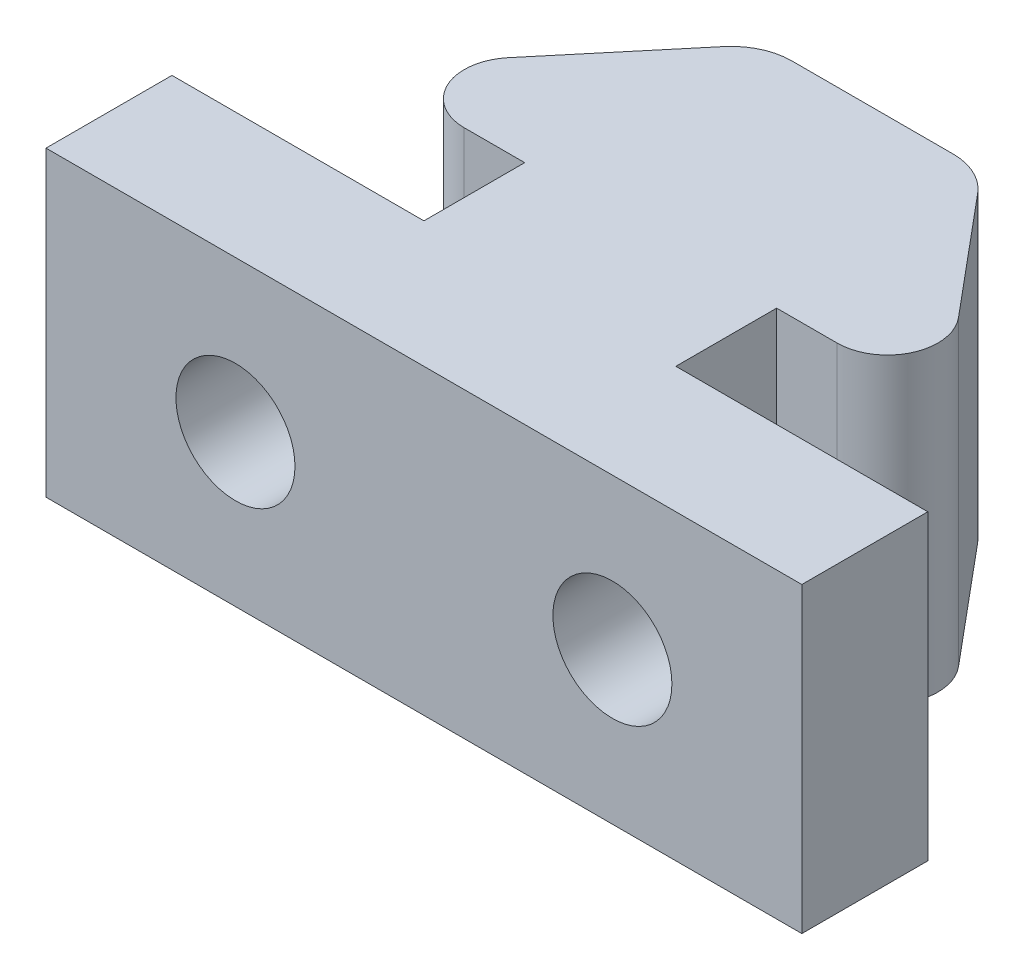
ISO-10303-21;
HEADER;
FILE_DESCRIPTION(('STEP AP214'),'2;1');
FILE_NAME('part.step','',(''),(''),'','','');
FILE_SCHEMA(('AUTOMOTIVE_DESIGN { 1 0 10303 214 1 1 1 1 }'));
ENDSEC;
DATA;
#1=APPLICATION_CONTEXT('core data for automotive mechanical design processes');
#2=APPLICATION_PROTOCOL_DEFINITION('international standard','automotive_design',2000,#1);
#3=PRODUCT_CONTEXT('',#1,'mechanical');
#4=PRODUCT('Part','Part','',(#3));
#5=PRODUCT_RELATED_PRODUCT_CATEGORY('part','',(#4));
#6=PRODUCT_DEFINITION_FORMATION('','',#4);
#7=PRODUCT_DEFINITION_CONTEXT('part definition',#1,'design');
#8=PRODUCT_DEFINITION('design','',#6,#7);
#9=PRODUCT_DEFINITION_SHAPE('','',#8);
#10=(LENGTH_UNIT() NAMED_UNIT(*) SI_UNIT(.MILLI.,.METRE.));
#11=(NAMED_UNIT(*) PLANE_ANGLE_UNIT() SI_UNIT($,.RADIAN.));
#12=(NAMED_UNIT(*) SI_UNIT($,.STERADIAN.) SOLID_ANGLE_UNIT());
#13=UNCERTAINTY_MEASURE_WITH_UNIT(LENGTH_MEASURE(1.E-05),#10,'distance_accuracy_value','');
#14=(GEOMETRIC_REPRESENTATION_CONTEXT(3) GLOBAL_UNCERTAINTY_ASSIGNED_CONTEXT((#13)) GLOBAL_UNIT_ASSIGNED_CONTEXT((#10,
#11,#12)) REPRESENTATION_CONTEXT('',''));
#15=CARTESIAN_POINT('',(0.,0.,0.));
#16=DIRECTION('',(0.,0.,1.));
#17=DIRECTION('',(1.,0.,0.));
#18=AXIS2_PLACEMENT_3D('',#15,#16,#17);
#19=CARTESIAN_POINT('',(0.,0.,0.));
#20=DIRECTION('',(0.,0.,1.));
#21=DIRECTION('',(1.,0.,0.));
#22=AXIS2_PLACEMENT_3D('',#19,#20,#21);
#23=PLANE('',#22);
#24=CARTESIAN_POINT('',(-4.75,0.,0.));
#25=DIRECTION('',(0.,0.,1.));
#26=DIRECTION('',(1.,0.,0.));
#27=AXIS2_PLACEMENT_3D('',#24,#25,#26);
#28=CIRCLE('',#27,1.5);
#29=CARTESIAN_POINT('',(-3.25,0.,0.));
#30=VERTEX_POINT('',#29);
#31=EDGE_CURVE('E180',#30,#30,#28,.F.);
#32=ORIENTED_EDGE('',*,*,#31,.F.);
#33=EDGE_LOOP('',(#32));
#34=FACE_BOUND('',#33,.T.);
#35=DIRECTION('',(0.,1.,0.));
#36=VECTOR('',#35,1.);
#37=CARTESIAN_POINT('',(-3.175,-18.2529235263508,0.));
#38=LINE('',#37,#36);
#39=CARTESIAN_POINT('',(-3.175,-3.81,0.));
#40=VERTEX_POINT('',#39);
#41=CARTESIAN_POINT('',(-3.175,3.81,0.));
#42=VERTEX_POINT('',#41);
#43=EDGE_CURVE('E64',#40,#42,#38,.T.);
#44=ORIENTED_EDGE('',*,*,#43,.F.);
#45=DIRECTION('',(1.,0.,0.));
#46=VECTOR('',#45,1.);
#47=CARTESIAN_POINT('',(-9.525,-3.81,0.));
#48=LINE('',#47,#46);
#49=CARTESIAN_POINT('',(-9.525,-3.81,0.));
#50=VERTEX_POINT('',#49);
#51=EDGE_CURVE('E251',#50,#40,#48,.T.);
#52=ORIENTED_EDGE('',*,*,#51,.F.);
#53=DIRECTION('',(0.,1.,0.));
#54=VECTOR('',#53,1.);
#55=CARTESIAN_POINT('',(-9.525,-3.81,0.));
#56=LINE('',#55,#54);
#57=CARTESIAN_POINT('',(-9.525,3.81,0.));
#58=VERTEX_POINT('',#57);
#59=EDGE_CURVE('E239',#50,#58,#56,.T.);
#60=ORIENTED_EDGE('',*,*,#59,.T.);
#61=DIRECTION('',(1.,0.,0.));
#62=VECTOR('',#61,1.);
#63=CARTESIAN_POINT('',(-9.525,3.81,0.));
#64=LINE('',#63,#62);
#65=EDGE_CURVE('E246',#58,#42,#64,.T.);
#66=ORIENTED_EDGE('',*,*,#65,.T.);
#67=EDGE_LOOP('',(#44,#52,#60,#66));
#68=FACE_BOUND('',#67,.T.);
#69=ADVANCED_FACE('F39',(#34,#68),#23,.F.);
#70=CARTESIAN_POINT('',(-9.525,3.81,3.175));
#71=DIRECTION('',(0.,1.,0.));
#72=DIRECTION('',(0.,0.,1.));
#73=AXIS2_PLACEMENT_3D('',#70,#71,#72);
#74=PLANE('',#73);
#75=ORIENTED_EDGE('',*,*,#65,.F.);
#76=DIRECTION('',(0.,0.,-1.));
#77=VECTOR('',#76,1.);
#78=CARTESIAN_POINT('',(-9.525,3.81,3.175));
#79=LINE('',#78,#77);
#80=CARTESIAN_POINT('',(-9.525,3.81,3.175));
#81=VERTEX_POINT('',#80);
#82=EDGE_CURVE('E11',#81,#58,#79,.T.);
#83=ORIENTED_EDGE('',*,*,#82,.F.);
#84=DIRECTION('',(1.,0.,0.));
#85=VECTOR('',#84,1.);
#86=CARTESIAN_POINT('',(-9.525,3.81,3.175));
#87=LINE('',#86,#85);
#88=CARTESIAN_POINT('',(9.525,3.81,3.175));
#89=VERTEX_POINT('',#88);
#90=EDGE_CURVE('E235',#81,#89,#87,.T.);
#91=ORIENTED_EDGE('',*,*,#90,.T.);
#92=DIRECTION('',(0.,0.,-1.));
#93=VECTOR('',#92,1.);
#94=CARTESIAN_POINT('',(9.525,3.81,3.175));
#95=LINE('',#94,#93);
#96=CARTESIAN_POINT('',(9.525,3.81,0.));
#97=VERTEX_POINT('',#96);
#98=EDGE_CURVE('E43',#89,#97,#95,.T.);
#99=ORIENTED_EDGE('',*,*,#98,.T.);
#100=CARTESIAN_POINT('',(3.175,3.81,0.));
#101=VERTEX_POINT('',#100);
#102=EDGE_CURVE('E179',#101,#97,#64,.T.);
#103=ORIENTED_EDGE('',*,*,#102,.F.);
#104=DIRECTION('',(0.,0.,-1.));
#105=VECTOR('',#104,1.);
#106=CARTESIAN_POINT('',(3.175,3.81,0.));
#107=LINE('',#106,#105);
#108=CARTESIAN_POINT('',(3.175,3.81,-2.54));
#109=VERTEX_POINT('',#108);
#110=EDGE_CURVE('E160',#101,#109,#107,.T.);
#111=ORIENTED_EDGE('',*,*,#110,.T.);
#112=DIRECTION('',(1.,0.,0.));
#113=VECTOR('',#112,1.);
#114=CARTESIAN_POINT('',(3.175,3.81,-2.54));
#115=LINE('',#114,#113);
#116=CARTESIAN_POINT('',(4.69937299864937,3.81,-2.54));
#117=VERTEX_POINT('',#116);
#118=EDGE_CURVE('E168',#109,#117,#115,.T.);
#119=ORIENTED_EDGE('',*,*,#118,.T.);
#120=CARTESIAN_POINT('',(4.69937299864937,3.81,-3.81));
#121=DIRECTION('',(0.,1.,0.));
#122=DIRECTION('',(0.,0.,1.));
#123=AXIS2_PLACEMENT_3D('',#120,#121,#122);
#124=CIRCLE('',#123,1.27);
#125=CARTESIAN_POINT('',(5.67365047720945,3.81,-4.6246676590921));
#126=VERTEX_POINT('',#125);
#127=EDGE_CURVE('E174',#117,#126,#124,.T.);
#128=ORIENTED_EDGE('',*,*,#127,.T.);
#129=DIRECTION('',(-0.64147059771032,0.,-0.767147620913449));
#130=VECTOR('',#129,1.);
#131=CARTESIAN_POINT('',(5.67365047720945,3.81,-4.62466765909211));
#132=LINE('',#131,#130);
#133=CARTESIAN_POINT('',(3.20113297427209,3.81,-7.58160119091053));
#134=VERTEX_POINT('',#133);
#135=EDGE_CURVE('E190',#126,#134,#132,.T.);
#136=ORIENTED_EDGE('',*,*,#135,.T.);
#137=CARTESIAN_POINT('',(2.032,3.81,-6.604));
#138=DIRECTION('',(0.,1.,0.));
#139=DIRECTION('',(0.,0.,1.));
#140=AXIS2_PLACEMENT_3D('',#137,#138,#139);
#141=CIRCLE('',#140,1.524);
#142=CARTESIAN_POINT('',(2.032,3.81,-8.128));
#143=VERTEX_POINT('',#142);
#144=EDGE_CURVE('E193',#134,#143,#141,.T.);
#145=ORIENTED_EDGE('',*,*,#144,.T.);
#146=DIRECTION('',(-1.,0.,0.));
#147=VECTOR('',#146,1.);
#148=CARTESIAN_POINT('',(2.032,3.81,-8.128));
#149=LINE('',#148,#147);
#150=CARTESIAN_POINT('',(-2.032,3.81,-8.128));
#151=VERTEX_POINT('',#150);
#152=EDGE_CURVE('E196',#143,#151,#149,.T.);
#153=ORIENTED_EDGE('',*,*,#152,.T.);
#154=CARTESIAN_POINT('',(-2.032,3.81,-6.604));
#155=DIRECTION('',(0.,1.,0.));
#156=DIRECTION('',(0.,0.,-1.));
#157=AXIS2_PLACEMENT_3D('',#154,#155,#156);
#158=CIRCLE('',#157,1.524);
#159=CARTESIAN_POINT('',(-3.2011329742721,3.81,-7.58160119091053));
#160=VERTEX_POINT('',#159);
#161=EDGE_CURVE('E199',#151,#160,#158,.T.);
#162=ORIENTED_EDGE('',*,*,#161,.T.);
#163=DIRECTION('',(-0.64147059771032,0.,0.767147620913449));
#164=VECTOR('',#163,1.);
#165=CARTESIAN_POINT('',(-5.67365047720945,3.81,-4.62466765909211));
#166=LINE('',#165,#164);
#167=CARTESIAN_POINT('',(-5.67365047720945,3.81,-4.62466765909211));
#168=VERTEX_POINT('',#167);
#169=EDGE_CURVE('E202',#160,#168,#166,.T.);
#170=ORIENTED_EDGE('',*,*,#169,.T.);
#171=CARTESIAN_POINT('',(-4.69937299864937,3.81,-3.81));
#172=DIRECTION('',(0.,1.,0.));
#173=DIRECTION('',(0.,0.,-1.));
#174=AXIS2_PLACEMENT_3D('',#171,#172,#173);
#175=CIRCLE('',#174,1.27);
#176=CARTESIAN_POINT('',(-4.69937299864937,3.81,-2.54));
#177=VERTEX_POINT('',#176);
#178=EDGE_CURVE('E205',#168,#177,#175,.T.);
#179=ORIENTED_EDGE('',*,*,#178,.T.);
#180=DIRECTION('',(1.,0.,0.));
#181=VECTOR('',#180,1.);
#182=CARTESIAN_POINT('',(-3.175,3.81,-2.54));
#183=LINE('',#182,#181);
#184=CARTESIAN_POINT('',(-3.175,3.81,-2.54));
#185=VERTEX_POINT('',#184);
#186=EDGE_CURVE('E208',#177,#185,#183,.T.);
#187=ORIENTED_EDGE('',*,*,#186,.T.);
#188=DIRECTION('',(0.,0.,1.));
#189=VECTOR('',#188,1.);
#190=CARTESIAN_POINT('',(-3.175,3.81,0.));
#191=LINE('',#190,#189);
#192=EDGE_CURVE('E211',#185,#42,#191,.T.);
#193=ORIENTED_EDGE('',*,*,#192,.T.);
#194=EDGE_LOOP('',(#75,#83,#91,#99,#103,#111,#119,#128,#136,#145,#153,#162,#170,#179,#187,#193));
#195=FACE_BOUND('',#194,.T.);
#196=ADVANCED_FACE('F41',(#195),#74,.T.);
#197=CARTESIAN_POINT('',(-9.525,-3.81,3.175));
#198=DIRECTION('',(-1.,0.,0.));
#199=DIRECTION('',(0.,0.,1.));
#200=AXIS2_PLACEMENT_3D('',#197,#198,#199);
#201=PLANE('',#200);
#202=ORIENTED_EDGE('',*,*,#59,.F.);
#203=DIRECTION('',(0.,0.,-1.));
#204=VECTOR('',#203,1.);
#205=CARTESIAN_POINT('',(-9.525,-3.81,3.175));
#206=LINE('',#205,#204);
#207=CARTESIAN_POINT('',(-9.525,-3.81,3.175));
#208=VERTEX_POINT('',#207);
#209=EDGE_CURVE('E48',#208,#50,#206,.T.);
#210=ORIENTED_EDGE('',*,*,#209,.F.);
#211=DIRECTION('',(0.,1.,0.));
#212=VECTOR('',#211,1.);
#213=CARTESIAN_POINT('',(-9.525,-3.81,3.175));
#214=LINE('',#213,#212);
#215=EDGE_CURVE('E243',#208,#81,#214,.T.);
#216=ORIENTED_EDGE('',*,*,#215,.T.);
#217=ORIENTED_EDGE('',*,*,#82,.T.);
#218=EDGE_LOOP('',(#202,#210,#216,#217));
#219=FACE_BOUND('',#218,.T.);
#220=ADVANCED_FACE('F287',(#219),#201,.T.);
#221=CARTESIAN_POINT('',(-9.525,-3.81,3.175));
#222=DIRECTION('',(0.,1.,0.));
#223=DIRECTION('',(0.,0.,1.));
#224=AXIS2_PLACEMENT_3D('',#221,#222,#223);
#225=PLANE('',#224);
#226=ORIENTED_EDGE('',*,*,#51,.T.);
#227=DIRECTION('',(0.,0.,-1.));
#228=VECTOR('',#227,1.);
#229=CARTESIAN_POINT('',(-3.175,-3.81,0.));
#230=LINE('',#229,#228);
#231=CARTESIAN_POINT('',(-3.175,-3.81,-2.54));
#232=VERTEX_POINT('',#231);
#233=EDGE_CURVE('E186',#40,#232,#230,.T.);
#234=ORIENTED_EDGE('',*,*,#233,.T.);
#235=DIRECTION('',(-1.,0.,0.));
#236=VECTOR('',#235,1.);
#237=CARTESIAN_POINT('',(-3.175,-3.81,-2.54));
#238=LINE('',#237,#236);
#239=CARTESIAN_POINT('',(-4.69937299864937,-3.81,-2.54));
#240=VERTEX_POINT('',#239);
#241=EDGE_CURVE('E319',#232,#240,#238,.T.);
#242=ORIENTED_EDGE('',*,*,#241,.T.);
#243=CARTESIAN_POINT('',(-4.69937299864937,-3.81,-3.81));
#244=DIRECTION('',(0.,1.,0.));
#245=DIRECTION('',(0.,0.,1.));
#246=AXIS2_PLACEMENT_3D('',#243,#244,#245);
#247=CIRCLE('',#246,1.27);
#248=CARTESIAN_POINT('',(-5.67365047720945,-3.81,-4.62466765909211));
#249=VERTEX_POINT('',#248);
#250=EDGE_CURVE('E318',#240,#249,#247,.F.);
#251=ORIENTED_EDGE('',*,*,#250,.T.);
#252=DIRECTION('',(0.641470597710321,0.,-0.767147620913449));
#253=VECTOR('',#252,1.);
#254=CARTESIAN_POINT('',(-5.67365047720945,-3.81,-4.62466765909211));
#255=LINE('',#254,#253);
#256=CARTESIAN_POINT('',(-3.2011329742721,-3.81,-7.58160119091053));
#257=VERTEX_POINT('',#256);
#258=EDGE_CURVE('E316',#249,#257,#255,.T.);
#259=ORIENTED_EDGE('',*,*,#258,.T.);
#260=CARTESIAN_POINT('',(-2.032,-3.81,-6.604));
#261=DIRECTION('',(0.,1.,0.));
#262=DIRECTION('',(0.,0.,1.));
#263=AXIS2_PLACEMENT_3D('',#260,#261,#262);
#264=CIRCLE('',#263,1.524);
#265=CARTESIAN_POINT('',(-2.032,-3.81,-8.128));
#266=VERTEX_POINT('',#265);
#267=EDGE_CURVE('E314',#257,#266,#264,.F.);
#268=ORIENTED_EDGE('',*,*,#267,.T.);
#269=DIRECTION('',(1.,0.,0.));
#270=VECTOR('',#269,1.);
#271=CARTESIAN_POINT('',(2.032,-3.81,-8.128));
#272=LINE('',#271,#270);
#273=CARTESIAN_POINT('',(2.032,-3.81,-8.128));
#274=VERTEX_POINT('',#273);
#275=EDGE_CURVE('E312',#266,#274,#272,.T.);
#276=ORIENTED_EDGE('',*,*,#275,.T.);
#277=CARTESIAN_POINT('',(2.032,-3.81,-6.604));
#278=DIRECTION('',(0.,1.,0.));
#279=DIRECTION('',(0.,0.,1.));
#280=AXIS2_PLACEMENT_3D('',#277,#278,#279);
#281=CIRCLE('',#280,1.524);
#282=CARTESIAN_POINT('',(3.20113297427209,-3.81,-7.58160119091053));
#283=VERTEX_POINT('',#282);
#284=EDGE_CURVE('E310',#274,#283,#281,.F.);
#285=ORIENTED_EDGE('',*,*,#284,.T.);
#286=DIRECTION('',(0.641470597710321,0.,0.767147620913449));
#287=VECTOR('',#286,1.);
#288=CARTESIAN_POINT('',(5.67365047720945,-3.81,-4.62466765909211));
#289=LINE('',#288,#287);
#290=CARTESIAN_POINT('',(5.67365047720945,-3.81,-4.6246676590921));
#291=VERTEX_POINT('',#290);
#292=EDGE_CURVE('E308',#283,#291,#289,.T.);
#293=ORIENTED_EDGE('',*,*,#292,.T.);
#294=CARTESIAN_POINT('',(4.69937299864937,-3.81,-3.81));
#295=DIRECTION('',(0.,1.,0.));
#296=DIRECTION('',(0.,0.,1.));
#297=AXIS2_PLACEMENT_3D('',#294,#295,#296);
#298=CIRCLE('',#297,1.27);
#299=CARTESIAN_POINT('',(4.69937299864937,-3.81,-2.54));
#300=VERTEX_POINT('',#299);
#301=EDGE_CURVE('E306',#291,#300,#298,.F.);
#302=ORIENTED_EDGE('',*,*,#301,.T.);
#303=DIRECTION('',(-1.,0.,0.));
#304=VECTOR('',#303,1.);
#305=CARTESIAN_POINT('',(3.175,-3.81,-2.54));
#306=LINE('',#305,#304);
#307=CARTESIAN_POINT('',(3.175,-3.81,-2.54));
#308=VERTEX_POINT('',#307);
#309=EDGE_CURVE('E215',#300,#308,#306,.T.);
#310=ORIENTED_EDGE('',*,*,#309,.T.);
#311=DIRECTION('',(0.,0.,1.));
#312=VECTOR('',#311,1.);
#313=CARTESIAN_POINT('',(3.175,-3.81,0.));
#314=LINE('',#313,#312);
#315=CARTESIAN_POINT('',(3.175,-3.81,0.));
#316=VERTEX_POINT('',#315);
#317=EDGE_CURVE('E161',#308,#316,#314,.T.);
#318=ORIENTED_EDGE('',*,*,#317,.T.);
#319=CARTESIAN_POINT('',(9.525,-3.81,0.));
#320=VERTEX_POINT('',#319);
#321=EDGE_CURVE('E56',#316,#320,#48,.T.);
#322=ORIENTED_EDGE('',*,*,#321,.T.);
#323=DIRECTION('',(0.,0.,-1.));
#324=VECTOR('',#323,1.);
#325=CARTESIAN_POINT('',(9.525,-3.81,3.175));
#326=LINE('',#325,#324);
#327=CARTESIAN_POINT('',(9.525,-3.81,3.175));
#328=VERTEX_POINT('',#327);
#329=EDGE_CURVE('E255',#328,#320,#326,.T.);
#330=ORIENTED_EDGE('',*,*,#329,.F.);
#331=DIRECTION('',(1.,0.,0.));
#332=VECTOR('',#331,1.);
#333=CARTESIAN_POINT('',(-9.525,-3.81,3.175));
#334=LINE('',#333,#332);
#335=EDGE_CURVE('E241',#208,#328,#334,.T.);
#336=ORIENTED_EDGE('',*,*,#335,.F.);
#337=ORIENTED_EDGE('',*,*,#209,.T.);
#338=EDGE_LOOP('',(#226,#234,#242,#251,#259,#268,#276,#285,#293,#302,#310,#318,#322,#330,#336,#337));
#339=FACE_BOUND('',#338,.T.);
#340=ADVANCED_FACE('F324',(#339),#225,.F.);
#341=CARTESIAN_POINT('',(9.525,-3.81,3.175));
#342=DIRECTION('',(-1.,0.,0.));
#343=DIRECTION('',(0.,0.,1.));
#344=AXIS2_PLACEMENT_3D('',#341,#342,#343);
#345=PLANE('',#344);
#346=DIRECTION('',(0.,1.,0.));
#347=VECTOR('',#346,1.);
#348=CARTESIAN_POINT('',(9.525,-3.81,0.));
#349=LINE('',#348,#347);
#350=EDGE_CURVE('E248',#320,#97,#349,.T.);
#351=ORIENTED_EDGE('',*,*,#350,.T.);
#352=ORIENTED_EDGE('',*,*,#98,.F.);
#353=DIRECTION('',(0.,1.,0.));
#354=VECTOR('',#353,1.);
#355=CARTESIAN_POINT('',(9.525,-3.81,3.175));
#356=LINE('',#355,#354);
#357=EDGE_CURVE('E238',#328,#89,#356,.T.);
#358=ORIENTED_EDGE('',*,*,#357,.F.);
#359=ORIENTED_EDGE('',*,*,#329,.T.);
#360=EDGE_LOOP('',(#351,#352,#358,#359));
#361=FACE_BOUND('',#360,.T.);
#362=ADVANCED_FACE('F262',(#361),#345,.F.);
#363=CARTESIAN_POINT('',(0.,0.,3.175));
#364=DIRECTION('',(0.,0.,1.));
#365=DIRECTION('',(1.,0.,0.));
#366=AXIS2_PLACEMENT_3D('',#363,#364,#365);
#367=PLANE('',#366);
#368=CARTESIAN_POINT('',(-4.75,0.,3.175));
#369=DIRECTION('',(0.,0.,1.));
#370=DIRECTION('',(1.,0.,0.));
#371=AXIS2_PLACEMENT_3D('',#368,#369,#370);
#372=CIRCLE('',#371,1.5);
#373=CARTESIAN_POINT('',(-3.25,0.,3.175));
#374=VERTEX_POINT('',#373);
#375=EDGE_CURVE('E183',#374,#374,#372,.T.);
#376=ORIENTED_EDGE('',*,*,#375,.F.);
#377=EDGE_LOOP('',(#376));
#378=FACE_BOUND('',#377,.T.);
#379=CARTESIAN_POINT('',(4.75,0.,3.175));
#380=DIRECTION('',(0.,0.,1.));
#381=DIRECTION('',(1.,0.,0.));
#382=AXIS2_PLACEMENT_3D('',#379,#380,#381);
#383=CIRCLE('',#382,1.5);
#384=CARTESIAN_POINT('',(6.25,0.,3.175));
#385=VERTEX_POINT('',#384);
#386=EDGE_CURVE('E297',#385,#385,#383,.T.);
#387=ORIENTED_EDGE('',*,*,#386,.F.);
#388=EDGE_LOOP('',(#387));
#389=FACE_BOUND('',#388,.T.);
#390=ORIENTED_EDGE('',*,*,#90,.F.);
#391=ORIENTED_EDGE('',*,*,#215,.F.);
#392=ORIENTED_EDGE('',*,*,#335,.T.);
#393=ORIENTED_EDGE('',*,*,#357,.T.);
#394=EDGE_LOOP('',(#390,#391,#392,#393));
#395=FACE_BOUND('',#394,.T.);
#396=ADVANCED_FACE('F266',(#378,#389,#395),#367,.T.);
#397=CARTESIAN_POINT('',(4.75,0.,0.));
#398=DIRECTION('',(0.,0.,1.));
#399=DIRECTION('',(1.,0.,0.));
#400=AXIS2_PLACEMENT_3D('',#397,#398,#399);
#401=CIRCLE('',#400,1.5);
#402=CARTESIAN_POINT('',(6.25,0.,0.));
#403=VERTEX_POINT('',#402);
#404=EDGE_CURVE('E300',#403,#403,#401,.F.);
#405=ORIENTED_EDGE('',*,*,#404,.F.);
#406=EDGE_LOOP('',(#405));
#407=FACE_BOUND('',#406,.T.);
#408=ORIENTED_EDGE('',*,*,#321,.F.);
#409=DIRECTION('',(0.,1.,0.));
#410=VECTOR('',#409,1.);
#411=CARTESIAN_POINT('',(3.175,-18.2529235263508,0.));
#412=LINE('',#411,#410);
#413=EDGE_CURVE('E165',#316,#101,#412,.T.);
#414=ORIENTED_EDGE('',*,*,#413,.T.);
#415=ORIENTED_EDGE('',*,*,#102,.T.);
#416=ORIENTED_EDGE('',*,*,#350,.F.);
#417=EDGE_LOOP('',(#408,#414,#415,#416));
#418=FACE_BOUND('',#417,.T.);
#419=ADVANCED_FACE('F263',(#407,#418),#23,.F.);
#420=CARTESIAN_POINT('',(-3.175,-18.2529235263508,0.));
#421=DIRECTION('',(-1.,0.,0.));
#422=DIRECTION('',(0.,0.,1.));
#423=AXIS2_PLACEMENT_3D('',#420,#421,#422);
#424=PLANE('',#423);
#425=ORIENTED_EDGE('',*,*,#233,.F.);
#426=ORIENTED_EDGE('',*,*,#43,.T.);
#427=ORIENTED_EDGE('',*,*,#192,.F.);
#428=DIRECTION('',(0.,1.,0.));
#429=VECTOR('',#428,1.);
#430=CARTESIAN_POINT('',(-3.175,-18.2529235263508,-2.54));
#431=LINE('',#430,#429);
#432=EDGE_CURVE('E216',#232,#185,#431,.T.);
#433=ORIENTED_EDGE('',*,*,#432,.F.);
#434=EDGE_LOOP('',(#425,#426,#427,#433));
#435=FACE_BOUND('',#434,.T.);
#436=ADVANCED_FACE('F265',(#435),#424,.T.);
#437=CARTESIAN_POINT('',(-3.175,-18.2529235263508,-2.54));
#438=DIRECTION('',(0.,0.,1.));
#439=DIRECTION('',(1.,0.,0.));
#440=AXIS2_PLACEMENT_3D('',#437,#438,#439);
#441=PLANE('',#440);
#442=ORIENTED_EDGE('',*,*,#241,.F.);
#443=ORIENTED_EDGE('',*,*,#432,.T.);
#444=ORIENTED_EDGE('',*,*,#186,.F.);
#445=DIRECTION('',(0.,1.,0.));
#446=VECTOR('',#445,1.);
#447=CARTESIAN_POINT('',(-4.69937299864937,-18.2529235263508,-2.54));
#448=LINE('',#447,#446);
#449=EDGE_CURVE('E218',#240,#177,#448,.T.);
#450=ORIENTED_EDGE('',*,*,#449,.F.);
#451=EDGE_LOOP('',(#442,#443,#444,#450));
#452=FACE_BOUND('',#451,.T.);
#453=ADVANCED_FACE('F274',(#452),#441,.T.);
#454=CARTESIAN_POINT('',(-4.69937299864937,-18.2529235263508,-3.81));
#455=DIRECTION('',(0.,1.,0.));
#456=DIRECTION('',(0.,0.,1.));
#457=AXIS2_PLACEMENT_3D('',#454,#455,#456);
#458=CYLINDRICAL_SURFACE('',#457,1.27);
#459=ORIENTED_EDGE('',*,*,#250,.F.);
#460=ORIENTED_EDGE('',*,*,#449,.T.);
#461=ORIENTED_EDGE('',*,*,#178,.F.);
#462=DIRECTION('',(0.,1.,0.));
#463=VECTOR('',#462,1.);
#464=CARTESIAN_POINT('',(-5.67365047720945,-18.2529235263508,-4.62466765909211));
#465=LINE('',#464,#463);
#466=EDGE_CURVE('E220',#249,#168,#465,.T.);
#467=ORIENTED_EDGE('',*,*,#466,.F.);
#468=EDGE_LOOP('',(#459,#460,#461,#467));
#469=FACE_BOUND('',#468,.T.);
#470=ADVANCED_FACE('F334',(#469),#458,.T.);
#471=CARTESIAN_POINT('',(-5.67365047720945,-18.2529235263508,-4.62466765909211));
#472=DIRECTION('',(-0.767147620913449,0.,-0.641470597710321));
#473=DIRECTION('',(-0.641470597710321,0.,0.767147620913449));
#474=AXIS2_PLACEMENT_3D('',#471,#472,#473);
#475=PLANE('',#474);
#476=ORIENTED_EDGE('',*,*,#258,.F.);
#477=ORIENTED_EDGE('',*,*,#466,.T.);
#478=ORIENTED_EDGE('',*,*,#169,.F.);
#479=DIRECTION('',(0.,1.,0.));
#480=VECTOR('',#479,1.);
#481=CARTESIAN_POINT('',(-3.2011329742721,-18.2529235263508,-7.58160119091053));
#482=LINE('',#481,#480);
#483=EDGE_CURVE('E222',#257,#160,#482,.T.);
#484=ORIENTED_EDGE('',*,*,#483,.F.);
#485=EDGE_LOOP('',(#476,#477,#478,#484));
#486=FACE_BOUND('',#485,.T.);
#487=ADVANCED_FACE('F339',(#486),#475,.T.);
#488=CARTESIAN_POINT('',(-2.032,-18.2529235263508,-6.604));
#489=DIRECTION('',(0.,1.,0.));
#490=DIRECTION('',(0.,0.,1.));
#491=AXIS2_PLACEMENT_3D('',#488,#489,#490);
#492=CYLINDRICAL_SURFACE('',#491,1.524);
#493=ORIENTED_EDGE('',*,*,#267,.F.);
#494=ORIENTED_EDGE('',*,*,#483,.T.);
#495=ORIENTED_EDGE('',*,*,#161,.F.);
#496=DIRECTION('',(0.,1.,0.));
#497=VECTOR('',#496,1.);
#498=CARTESIAN_POINT('',(-2.032,-18.2529235263508,-8.128));
#499=LINE('',#498,#497);
#500=EDGE_CURVE('E224',#266,#151,#499,.T.);
#501=ORIENTED_EDGE('',*,*,#500,.F.);
#502=EDGE_LOOP('',(#493,#494,#495,#501));
#503=FACE_BOUND('',#502,.T.);
#504=ADVANCED_FACE('F342',(#503),#492,.T.);
#505=CARTESIAN_POINT('',(2.032,-18.2529235263508,-8.128));
#506=DIRECTION('',(0.,0.,-1.));
#507=DIRECTION('',(-1.,0.,0.));
#508=AXIS2_PLACEMENT_3D('',#505,#506,#507);
#509=PLANE('',#508);
#510=ORIENTED_EDGE('',*,*,#275,.F.);
#511=ORIENTED_EDGE('',*,*,#500,.T.);
#512=ORIENTED_EDGE('',*,*,#152,.F.);
#513=DIRECTION('',(0.,1.,0.));
#514=VECTOR('',#513,1.);
#515=CARTESIAN_POINT('',(2.032,-18.2529235263508,-8.128));
#516=LINE('',#515,#514);
#517=EDGE_CURVE('E226',#274,#143,#516,.T.);
#518=ORIENTED_EDGE('',*,*,#517,.F.);
#519=EDGE_LOOP('',(#510,#511,#512,#518));
#520=FACE_BOUND('',#519,.T.);
#521=ADVANCED_FACE('F348',(#520),#509,.T.);
#522=CARTESIAN_POINT('',(2.032,-18.2529235263508,-6.604));
#523=DIRECTION('',(0.,1.,0.));
#524=DIRECTION('',(0.,0.,1.));
#525=AXIS2_PLACEMENT_3D('',#522,#523,#524);
#526=CYLINDRICAL_SURFACE('',#525,1.524);
#527=ORIENTED_EDGE('',*,*,#284,.F.);
#528=ORIENTED_EDGE('',*,*,#517,.T.);
#529=ORIENTED_EDGE('',*,*,#144,.F.);
#530=DIRECTION('',(0.,1.,0.));
#531=VECTOR('',#530,1.);
#532=CARTESIAN_POINT('',(3.20113297427209,-18.2529235263508,-7.58160119091053));
#533=LINE('',#532,#531);
#534=EDGE_CURVE('E228',#283,#134,#533,.T.);
#535=ORIENTED_EDGE('',*,*,#534,.F.);
#536=EDGE_LOOP('',(#527,#528,#529,#535));
#537=FACE_BOUND('',#536,.T.);
#538=ADVANCED_FACE('F352',(#537),#526,.T.);
#539=CARTESIAN_POINT('',(5.67365047720945,-18.2529235263508,-4.62466765909211));
#540=DIRECTION('',(0.767147620913449,0.,-0.641470597710321));
#541=DIRECTION('',(-0.641470597710321,0.,-0.767147620913449));
#542=AXIS2_PLACEMENT_3D('',#539,#540,#541);
#543=PLANE('',#542);
#544=ORIENTED_EDGE('',*,*,#292,.F.);
#545=ORIENTED_EDGE('',*,*,#534,.T.);
#546=ORIENTED_EDGE('',*,*,#135,.F.);
#547=DIRECTION('',(0.,1.,0.));
#548=VECTOR('',#547,1.);
#549=CARTESIAN_POINT('',(5.67365047720945,-18.2529235263508,-4.6246676590921));
#550=LINE('',#549,#548);
#551=EDGE_CURVE('E230',#291,#126,#550,.T.);
#552=ORIENTED_EDGE('',*,*,#551,.F.);
#553=EDGE_LOOP('',(#544,#545,#546,#552));
#554=FACE_BOUND('',#553,.T.);
#555=ADVANCED_FACE('F358',(#554),#543,.T.);
#556=CARTESIAN_POINT('',(4.69937299864937,-18.2529235263508,-3.81));
#557=DIRECTION('',(0.,1.,0.));
#558=DIRECTION('',(0.,0.,1.));
#559=AXIS2_PLACEMENT_3D('',#556,#557,#558);
#560=CYLINDRICAL_SURFACE('',#559,1.27);
#561=ORIENTED_EDGE('',*,*,#301,.F.);
#562=ORIENTED_EDGE('',*,*,#551,.T.);
#563=ORIENTED_EDGE('',*,*,#127,.F.);
#564=DIRECTION('',(0.,1.,0.));
#565=VECTOR('',#564,1.);
#566=CARTESIAN_POINT('',(4.69937299864937,-18.2529235263508,-2.54));
#567=LINE('',#566,#565);
#568=EDGE_CURVE('E164',#300,#117,#567,.T.);
#569=ORIENTED_EDGE('',*,*,#568,.F.);
#570=EDGE_LOOP('',(#561,#562,#563,#569));
#571=FACE_BOUND('',#570,.T.);
#572=ADVANCED_FACE('F361',(#571),#560,.T.);
#573=CARTESIAN_POINT('',(3.175,-18.2529235263508,-2.54));
#574=DIRECTION('',(0.,0.,1.));
#575=DIRECTION('',(1.,0.,0.));
#576=AXIS2_PLACEMENT_3D('',#573,#574,#575);
#577=PLANE('',#576);
#578=ORIENTED_EDGE('',*,*,#309,.F.);
#579=ORIENTED_EDGE('',*,*,#568,.T.);
#580=ORIENTED_EDGE('',*,*,#118,.F.);
#581=DIRECTION('',(0.,1.,0.));
#582=VECTOR('',#581,1.);
#583=CARTESIAN_POINT('',(3.175,-18.2529235263508,-2.54));
#584=LINE('',#583,#582);
#585=EDGE_CURVE('E155',#308,#109,#584,.T.);
#586=ORIENTED_EDGE('',*,*,#585,.F.);
#587=EDGE_LOOP('',(#578,#579,#580,#586));
#588=FACE_BOUND('',#587,.T.);
#589=ADVANCED_FACE('F169',(#588),#577,.T.);
#590=CARTESIAN_POINT('',(3.175,-18.2529235263508,0.));
#591=DIRECTION('',(1.,0.,0.));
#592=DIRECTION('',(0.,0.,-1.));
#593=AXIS2_PLACEMENT_3D('',#590,#591,#592);
#594=PLANE('',#593);
#595=ORIENTED_EDGE('',*,*,#317,.F.);
#596=ORIENTED_EDGE('',*,*,#585,.T.);
#597=ORIENTED_EDGE('',*,*,#110,.F.);
#598=ORIENTED_EDGE('',*,*,#413,.F.);
#599=EDGE_LOOP('',(#595,#596,#597,#598));
#600=FACE_BOUND('',#599,.T.);
#601=ADVANCED_FACE('F157',(#600),#594,.T.);
#602=CARTESIAN_POINT('',(4.75,0.,-4.24264068711929));
#603=DIRECTION('',(0.,0.,1.));
#604=DIRECTION('',(1.,0.,0.));
#605=AXIS2_PLACEMENT_3D('',#602,#603,#604);
#606=CYLINDRICAL_SURFACE('',#605,1.5);
#607=CARTESIAN_POINT('',(6.25,0.,0.));
#608=CARTESIAN_POINT('',(6.25,0.,0.0330729166666668));
#609=CARTESIAN_POINT('',(6.25,0.,0.0661458333333336));
#610=CARTESIAN_POINT('',(6.25,0.,0.132291666666667));
#611=CARTESIAN_POINT('',(6.25,0.,0.165364583333333));
#612=CARTESIAN_POINT('',(6.25,0.,0.231510416666667));
#613=CARTESIAN_POINT('',(6.25,0.,0.264583333333333));
#614=CARTESIAN_POINT('',(6.25,0.,0.330729166666667));
#615=CARTESIAN_POINT('',(6.25,0.,0.363802083333333));
#616=CARTESIAN_POINT('',(6.25,0.,0.429947916666666));
#617=CARTESIAN_POINT('',(6.25,0.,0.463020833333333));
#618=CARTESIAN_POINT('',(6.25,0.,0.529166666666666));
#619=CARTESIAN_POINT('',(6.25,0.,0.562239583333333));
#620=CARTESIAN_POINT('',(6.25,0.,0.628385416666666));
#621=CARTESIAN_POINT('',(6.25,0.,0.661458333333333));
#622=CARTESIAN_POINT('',(6.25,0.,0.727604166666666));
#623=CARTESIAN_POINT('',(6.25,0.,0.760677083333333));
#624=CARTESIAN_POINT('',(6.25,0.,0.826822916666666));
#625=CARTESIAN_POINT('',(6.25,0.,0.859895833333333));
#626=CARTESIAN_POINT('',(6.25,0.,0.926041666666666));
#627=CARTESIAN_POINT('',(6.25,0.,0.959114583333333));
#628=CARTESIAN_POINT('',(6.25,0.,1.02526041666667));
#629=CARTESIAN_POINT('',(6.25,0.,1.05833333333333));
#630=CARTESIAN_POINT('',(6.25,0.,1.12447916666667));
#631=CARTESIAN_POINT('',(6.25,0.,1.15755208333333));
#632=CARTESIAN_POINT('',(6.25,0.,1.22369791666667));
#633=CARTESIAN_POINT('',(6.25,0.,1.25677083333333));
#634=CARTESIAN_POINT('',(6.25,0.,1.32291666666667));
#635=CARTESIAN_POINT('',(6.25,0.,1.35598958333333));
#636=CARTESIAN_POINT('',(6.25,0.,1.42213541666667));
#637=CARTESIAN_POINT('',(6.25,0.,1.45520833333333));
#638=CARTESIAN_POINT('',(6.25,0.,1.52135416666667));
#639=CARTESIAN_POINT('',(6.25,0.,1.55442708333333));
#640=CARTESIAN_POINT('',(6.25,0.,1.62057291666667));
#641=CARTESIAN_POINT('',(6.25,0.,1.65364583333333));
#642=CARTESIAN_POINT('',(6.25,0.,1.71979166666667));
#643=CARTESIAN_POINT('',(6.25,0.,1.75286458333333));
#644=CARTESIAN_POINT('',(6.25,0.,1.81901041666667));
#645=CARTESIAN_POINT('',(6.25,0.,1.85208333333333));
#646=CARTESIAN_POINT('',(6.25,0.,1.91822916666667));
#647=CARTESIAN_POINT('',(6.25,0.,1.95130208333333));
#648=CARTESIAN_POINT('',(6.25,0.,2.01744791666667));
#649=CARTESIAN_POINT('',(6.25,0.,2.05052083333333));
#650=CARTESIAN_POINT('',(6.25,0.,2.11666666666667));
#651=CARTESIAN_POINT('',(6.25,0.,2.14973958333333));
#652=CARTESIAN_POINT('',(6.25,0.,2.21588541666667));
#653=CARTESIAN_POINT('',(6.25,0.,2.24895833333333));
#654=CARTESIAN_POINT('',(6.25,0.,2.31510416666667));
#655=CARTESIAN_POINT('',(6.25,0.,2.34817708333333));
#656=CARTESIAN_POINT('',(6.25,0.,2.41432291666667));
#657=CARTESIAN_POINT('',(6.25,0.,2.44739583333333));
#658=CARTESIAN_POINT('',(6.25,0.,2.51354166666667));
#659=CARTESIAN_POINT('',(6.25,0.,2.54661458333333));
#660=CARTESIAN_POINT('',(6.25,0.,2.61276041666667));
#661=CARTESIAN_POINT('',(6.25,0.,2.64583333333333));
#662=CARTESIAN_POINT('',(6.25,0.,2.71197916666667));
#663=CARTESIAN_POINT('',(6.25,0.,2.74505208333333));
#664=CARTESIAN_POINT('',(6.25,0.,2.81119791666667));
#665=CARTESIAN_POINT('',(6.25,0.,2.84427083333333));
#666=CARTESIAN_POINT('',(6.25,0.,2.91041666666667));
#667=CARTESIAN_POINT('',(6.25,0.,2.94348958333333));
#668=CARTESIAN_POINT('',(6.25,0.,3.00963541666667));
#669=CARTESIAN_POINT('',(6.25,0.,3.04270833333333));
#670=CARTESIAN_POINT('',(6.25,0.,3.10885416666667));
#671=CARTESIAN_POINT('',(6.25,0.,3.14192708333333));
#672=CARTESIAN_POINT('',(6.25,0.,3.175));
#673=B_SPLINE_CURVE_WITH_KNOTS('',3,(#607,#608,#609,#610,#611,#612,#613,#614,#615,#616,#617,
#618,#619,#620,#621,#622,#623,#624,#625,#626,#627,#628,#629,#630,#631,#632,#633,#634,#635,#636,
#637,#638,#639,#640,#641,#642,#643,#644,#645,#646,#647,#648,#649,#650,#651,#652,#653,#654,#655,
#656,#657,#658,#659,#660,#661,#662,#663,#664,#665,#666,#667,#668,#669,#670,#671,#672),
.UNSPECIFIED.,.F.,.F.,(4,2,2,2,2,2,2,2,2,2,2,2,2,2,2,2,2,2,2,2,2,2,2,2,2,2,2,2,2,2,2,2,4),(0.,
0.0992187500000004,0.1984375,0.29765625,0.396875,0.49609375,0.595312499999999,0.69453125,
0.793749999999999,0.89296875,0.9921875,1.09140625,1.190625,1.28984375,1.3890625,1.48828125,
1.5875,1.68671875,1.7859375,1.88515625,1.984375,2.08359375,2.1828125,2.28203125,2.38125,
2.48046875,2.5796875,2.67890625,2.778125,2.87734375,2.9765625,3.07578125,3.175),.UNSPECIFIED.);
#674=EDGE_CURVE('BSEAM293',#403,#385,#673,.T.);
#675=ORIENTED_EDGE('',*,*,#404,.T.);
#676=ORIENTED_EDGE('',*,*,#386,.T.);
#677=ORIENTED_EDGE('',*,*,#674,.T.);
#678=ORIENTED_EDGE('',*,*,#674,.F.);
#679=EDGE_LOOP('',(#675,#677,#676,#678));
#680=FACE_BOUND('',#679,.T.);
#681=ADVANCED_FACE('F293',(#680),#606,.F.);
#682=CARTESIAN_POINT('',(-4.75,0.,-4.24264068711929));
#683=DIRECTION('',(0.,0.,1.));
#684=DIRECTION('',(1.,0.,0.));
#685=AXIS2_PLACEMENT_3D('',#682,#683,#684);
#686=CYLINDRICAL_SURFACE('',#685,1.5);
#687=CARTESIAN_POINT('',(-3.25,0.,0.));
#688=CARTESIAN_POINT('',(-3.25,0.,0.0330729166666668));
#689=CARTESIAN_POINT('',(-3.25,0.,0.0661458333333336));
#690=CARTESIAN_POINT('',(-3.25,0.,0.132291666666667));
#691=CARTESIAN_POINT('',(-3.25,0.,0.165364583333333));
#692=CARTESIAN_POINT('',(-3.25,0.,0.231510416666667));
#693=CARTESIAN_POINT('',(-3.25,0.,0.264583333333333));
#694=CARTESIAN_POINT('',(-3.25,0.,0.330729166666667));
#695=CARTESIAN_POINT('',(-3.25,0.,0.363802083333333));
#696=CARTESIAN_POINT('',(-3.25,0.,0.429947916666666));
#697=CARTESIAN_POINT('',(-3.25,0.,0.463020833333333));
#698=CARTESIAN_POINT('',(-3.25,0.,0.529166666666666));
#699=CARTESIAN_POINT('',(-3.25,0.,0.562239583333333));
#700=CARTESIAN_POINT('',(-3.25,0.,0.628385416666666));
#701=CARTESIAN_POINT('',(-3.25,0.,0.661458333333333));
#702=CARTESIAN_POINT('',(-3.25,0.,0.727604166666666));
#703=CARTESIAN_POINT('',(-3.25,0.,0.760677083333333));
#704=CARTESIAN_POINT('',(-3.25,0.,0.826822916666666));
#705=CARTESIAN_POINT('',(-3.25,0.,0.859895833333333));
#706=CARTESIAN_POINT('',(-3.25,0.,0.926041666666666));
#707=CARTESIAN_POINT('',(-3.25,0.,0.959114583333333));
#708=CARTESIAN_POINT('',(-3.25,0.,1.02526041666667));
#709=CARTESIAN_POINT('',(-3.25,0.,1.05833333333333));
#710=CARTESIAN_POINT('',(-3.25,0.,1.12447916666667));
#711=CARTESIAN_POINT('',(-3.25,0.,1.15755208333333));
#712=CARTESIAN_POINT('',(-3.25,0.,1.22369791666667));
#713=CARTESIAN_POINT('',(-3.25,0.,1.25677083333333));
#714=CARTESIAN_POINT('',(-3.25,0.,1.32291666666667));
#715=CARTESIAN_POINT('',(-3.25,0.,1.35598958333333));
#716=CARTESIAN_POINT('',(-3.25,0.,1.42213541666667));
#717=CARTESIAN_POINT('',(-3.25,0.,1.45520833333333));
#718=CARTESIAN_POINT('',(-3.25,0.,1.52135416666667));
#719=CARTESIAN_POINT('',(-3.25,0.,1.55442708333333));
#720=CARTESIAN_POINT('',(-3.25,0.,1.62057291666667));
#721=CARTESIAN_POINT('',(-3.25,0.,1.65364583333333));
#722=CARTESIAN_POINT('',(-3.25,0.,1.71979166666667));
#723=CARTESIAN_POINT('',(-3.25,0.,1.75286458333333));
#724=CARTESIAN_POINT('',(-3.25,0.,1.81901041666667));
#725=CARTESIAN_POINT('',(-3.25,0.,1.85208333333333));
#726=CARTESIAN_POINT('',(-3.25,0.,1.91822916666667));
#727=CARTESIAN_POINT('',(-3.25,0.,1.95130208333333));
#728=CARTESIAN_POINT('',(-3.25,0.,2.01744791666667));
#729=CARTESIAN_POINT('',(-3.25,0.,2.05052083333333));
#730=CARTESIAN_POINT('',(-3.25,0.,2.11666666666667));
#731=CARTESIAN_POINT('',(-3.25,0.,2.14973958333333));
#732=CARTESIAN_POINT('',(-3.25,0.,2.21588541666667));
#733=CARTESIAN_POINT('',(-3.25,0.,2.24895833333333));
#734=CARTESIAN_POINT('',(-3.25,0.,2.31510416666667));
#735=CARTESIAN_POINT('',(-3.25,0.,2.34817708333333));
#736=CARTESIAN_POINT('',(-3.25,0.,2.41432291666667));
#737=CARTESIAN_POINT('',(-3.25,0.,2.44739583333333));
#738=CARTESIAN_POINT('',(-3.25,0.,2.51354166666667));
#739=CARTESIAN_POINT('',(-3.25,0.,2.54661458333333));
#740=CARTESIAN_POINT('',(-3.25,0.,2.61276041666667));
#741=CARTESIAN_POINT('',(-3.25,0.,2.64583333333333));
#742=CARTESIAN_POINT('',(-3.25,0.,2.71197916666667));
#743=CARTESIAN_POINT('',(-3.25,0.,2.74505208333333));
#744=CARTESIAN_POINT('',(-3.25,0.,2.81119791666667));
#745=CARTESIAN_POINT('',(-3.25,0.,2.84427083333333));
#746=CARTESIAN_POINT('',(-3.25,0.,2.91041666666667));
#747=CARTESIAN_POINT('',(-3.25,0.,2.94348958333333));
#748=CARTESIAN_POINT('',(-3.25,0.,3.00963541666667));
#749=CARTESIAN_POINT('',(-3.25,0.,3.04270833333333));
#750=CARTESIAN_POINT('',(-3.25,0.,3.10885416666667));
#751=CARTESIAN_POINT('',(-3.25,0.,3.14192708333333));
#752=CARTESIAN_POINT('',(-3.25,0.,3.175));
#753=B_SPLINE_CURVE_WITH_KNOTS('',3,(#687,#688,#689,#690,#691,#692,#693,#694,#695,#696,#697,
#698,#699,#700,#701,#702,#703,#704,#705,#706,#707,#708,#709,#710,#711,#712,#713,#714,#715,#716,
#717,#718,#719,#720,#721,#722,#723,#724,#725,#726,#727,#728,#729,#730,#731,#732,#733,#734,#735,
#736,#737,#738,#739,#740,#741,#742,#743,#744,#745,#746,#747,#748,#749,#750,#751,#752),
.UNSPECIFIED.,.F.,.F.,(4,2,2,2,2,2,2,2,2,2,2,2,2,2,2,2,2,2,2,2,2,2,2,2,2,2,2,2,2,2,2,2,4),(0.,
0.0992187500000004,0.1984375,0.29765625,0.396875,0.49609375,0.595312499999999,0.69453125,
0.793749999999999,0.89296875,0.9921875,1.09140625,1.190625,1.28984375,1.3890625,1.48828125,
1.5875,1.68671875,1.7859375,1.88515625,1.984375,2.08359375,2.1828125,2.28203125,2.38125,
2.48046875,2.5796875,2.67890625,2.778125,2.87734375,2.9765625,3.07578125,3.175),.UNSPECIFIED.);
#754=EDGE_CURVE('BSEAM290',#30,#374,#753,.T.);
#755=ORIENTED_EDGE('',*,*,#31,.T.);
#756=ORIENTED_EDGE('',*,*,#375,.T.);
#757=ORIENTED_EDGE('',*,*,#754,.T.);
#758=ORIENTED_EDGE('',*,*,#754,.F.);
#759=EDGE_LOOP('',(#755,#757,#756,#758));
#760=FACE_BOUND('',#759,.T.);
#761=ADVANCED_FACE('F290',(#760),#686,.F.);
#762=CLOSED_SHELL('',(#69,#196,#220,#340,#362,#396,#419,#436,#453,#470,#487,#504,#521,#538,#555,
#572,#589,#601,#681,#761));
#763=MANIFOLD_SOLID_BREP('B2',#762);
#764=ADVANCED_BREP_SHAPE_REPRESENTATION('',(#18,#763),#14);
#765=SHAPE_DEFINITION_REPRESENTATION(#9,#764);
ENDSEC;
END-ISO-10303-21;
